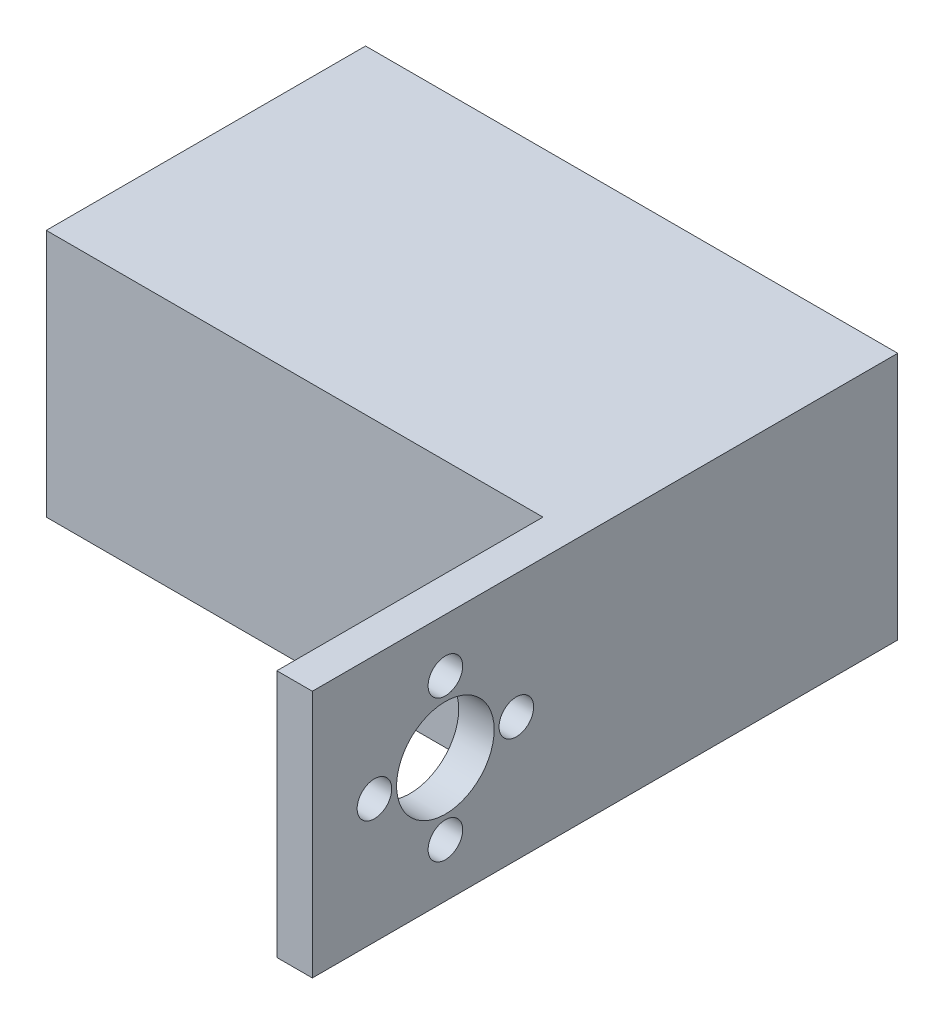
ISO-10303-21;
HEADER;
FILE_DESCRIPTION(('STEP AP214'),'2;1');
FILE_NAME('part.step','',(''),(''),'','','');
FILE_SCHEMA(('AUTOMOTIVE_DESIGN { 1 0 10303 214 1 1 1 1 }'));
ENDSEC;
DATA;
#1=APPLICATION_CONTEXT('core data for automotive mechanical design processes');
#2=APPLICATION_PROTOCOL_DEFINITION('international standard','automotive_design',2000,#1);
#3=PRODUCT_CONTEXT('',#1,'mechanical');
#4=PRODUCT('Part','Part','',(#3));
#5=PRODUCT_RELATED_PRODUCT_CATEGORY('part','',(#4));
#6=PRODUCT_DEFINITION_FORMATION('','',#4);
#7=PRODUCT_DEFINITION_CONTEXT('part definition',#1,'design');
#8=PRODUCT_DEFINITION('design','',#6,#7);
#9=PRODUCT_DEFINITION_SHAPE('','',#8);
#10=(LENGTH_UNIT() NAMED_UNIT(*) SI_UNIT(.MILLI.,.METRE.));
#11=(NAMED_UNIT(*) PLANE_ANGLE_UNIT() SI_UNIT($,.RADIAN.));
#12=(NAMED_UNIT(*) SI_UNIT($,.STERADIAN.) SOLID_ANGLE_UNIT());
#13=UNCERTAINTY_MEASURE_WITH_UNIT(LENGTH_MEASURE(1.E-05),#10,'distance_accuracy_value','');
#14=(GEOMETRIC_REPRESENTATION_CONTEXT(3) GLOBAL_UNCERTAINTY_ASSIGNED_CONTEXT((#13)) GLOBAL_UNIT_ASSIGNED_CONTEXT((#10,
#11,#12)) REPRESENTATION_CONTEXT('',''));
#15=CARTESIAN_POINT('',(0.,0.,0.));
#16=DIRECTION('',(0.,0.,1.));
#17=DIRECTION('',(1.,0.,0.));
#18=AXIS2_PLACEMENT_3D('',#15,#16,#17);
#19=CARTESIAN_POINT('',(0.,0.,36.));
#20=DIRECTION('',(0.,0.,1.));
#21=DIRECTION('',(1.,0.,0.));
#22=AXIS2_PLACEMENT_3D('',#19,#20,#21);
#23=PLANE('',#22);
#24=DIRECTION('',(1.,0.,0.));
#25=VECTOR('',#24,1.);
#26=CARTESIAN_POINT('',(-10.,-24.,36.));
#27=LINE('',#26,#25);
#28=CARTESIAN_POINT('',(-10.,-24.,36.));
#29=VERTEX_POINT('',#28);
#30=CARTESIAN_POINT('',(46.,-24.,36.));
#31=VERTEX_POINT('',#30);
#32=EDGE_CURVE('E142',#29,#31,#27,.T.);
#33=ORIENTED_EDGE('',*,*,#32,.T.);
#34=DIRECTION('',(0.,1.,0.));
#35=VECTOR('',#34,1.);
#36=CARTESIAN_POINT('',(46.,4.,36.));
#37=LINE('',#36,#35);
#38=CARTESIAN_POINT('',(46.,4.,36.));
#39=VERTEX_POINT('',#38);
#40=EDGE_CURVE('E130',#31,#39,#37,.T.);
#41=ORIENTED_EDGE('',*,*,#40,.T.);
#42=DIRECTION('',(-1.,0.,0.));
#43=VECTOR('',#42,1.);
#44=CARTESIAN_POINT('',(50.,4.,36.));
#45=LINE('',#44,#43);
#46=CARTESIAN_POINT('',(-10.,4.,36.));
#47=VERTEX_POINT('',#46);
#48=EDGE_CURVE('E129',#39,#47,#45,.T.);
#49=ORIENTED_EDGE('',*,*,#48,.T.);
#50=DIRECTION('',(0.,-1.,0.));
#51=VECTOR('',#50,1.);
#52=CARTESIAN_POINT('',(-10.,4.,36.));
#53=LINE('',#52,#51);
#54=EDGE_CURVE('E138',#47,#29,#53,.T.);
#55=ORIENTED_EDGE('',*,*,#54,.T.);
#56=EDGE_LOOP('',(#33,#41,#49,#55));
#57=FACE_BOUND('',#56,.T.);
#58=ADVANCED_FACE('F32',(#57),#23,.T.);
#59=CARTESIAN_POINT('',(0.,0.,0.));
#60=DIRECTION('',(0.,0.,1.));
#61=DIRECTION('',(1.,0.,0.));
#62=AXIS2_PLACEMENT_3D('',#59,#60,#61);
#63=PLANE('',#62);
#64=CARTESIAN_POINT('',(44.4000000000001,-14.9999999999999,0.));
#65=DIRECTION('',(0.,0.,-1.));
#66=DIRECTION('',(-1.,0.,0.));
#67=AXIS2_PLACEMENT_3D('',#64,#65,#66);
#68=CIRCLE('',#67,2.2);
#69=CARTESIAN_POINT('',(42.2000000000001,-14.9999999999999,0.));
#70=VERTEX_POINT('',#69);
#71=EDGE_CURVE('E476',#70,#70,#68,.T.);
#72=ORIENTED_EDGE('',*,*,#71,.F.);
#73=EDGE_LOOP('',(#72));
#74=FACE_BOUND('',#73,.T.);
#75=CARTESIAN_POINT('',(-4.4,-5.00000000000006,0.));
#76=DIRECTION('',(0.,0.,-1.));
#77=DIRECTION('',(-1.,0.,0.));
#78=AXIS2_PLACEMENT_3D('',#75,#76,#77);
#79=CIRCLE('',#78,2.19999999999996);
#80=CARTESIAN_POINT('',(-6.59999999999996,-5.00000000000006,0.));
#81=VERTEX_POINT('',#80);
#82=EDGE_CURVE('E490',#81,#81,#79,.T.);
#83=ORIENTED_EDGE('',*,*,#82,.F.);
#84=EDGE_LOOP('',(#83));
#85=FACE_BOUND('',#84,.T.);
#86=CARTESIAN_POINT('',(-4.4,-15.0000000000001,0.));
#87=DIRECTION('',(0.,0.,-1.));
#88=DIRECTION('',(-1.,0.,0.));
#89=AXIS2_PLACEMENT_3D('',#86,#87,#88);
#90=CIRCLE('',#89,2.19999999999996);
#91=CARTESIAN_POINT('',(-6.59999999999996,-15.0000000000001,0.));
#92=VERTEX_POINT('',#91);
#93=EDGE_CURVE('E485',#92,#92,#90,.T.);
#94=ORIENTED_EDGE('',*,*,#93,.F.);
#95=EDGE_LOOP('',(#94));
#96=FACE_BOUND('',#95,.T.);
#97=CARTESIAN_POINT('',(44.4000000000001,-4.99999999999993,0.));
#98=DIRECTION('',(0.,0.,-1.));
#99=DIRECTION('',(-1.,0.,0.));
#100=AXIS2_PLACEMENT_3D('',#97,#98,#99);
#101=CIRCLE('',#100,2.2);
#102=CARTESIAN_POINT('',(42.2000000000001,-4.99999999999993,0.));
#103=VERTEX_POINT('',#102);
#104=EDGE_CURVE('E475',#103,#103,#101,.T.);
#105=ORIENTED_EDGE('',*,*,#104,.F.);
#106=EDGE_LOOP('',(#105));
#107=FACE_BOUND('',#106,.T.);
#108=DIRECTION('',(0.,-1.,0.));
#109=VECTOR('',#108,1.);
#110=CARTESIAN_POINT('',(-10.,4.,0.));
#111=LINE('',#110,#109);
#112=CARTESIAN_POINT('',(-10.,4.,0.));
#113=VERTEX_POINT('',#112);
#114=CARTESIAN_POINT('',(-10.,-24.,0.));
#115=VERTEX_POINT('',#114);
#116=EDGE_CURVE('E178',#113,#115,#111,.T.);
#117=ORIENTED_EDGE('',*,*,#116,.F.);
#118=DIRECTION('',(-1.,0.,0.));
#119=VECTOR('',#118,1.);
#120=CARTESIAN_POINT('',(-10.,4.,0.));
#121=LINE('',#120,#119);
#122=CARTESIAN_POINT('',(50.,4.,0.));
#123=VERTEX_POINT('',#122);
#124=EDGE_CURVE('E185',#123,#113,#121,.T.);
#125=ORIENTED_EDGE('',*,*,#124,.F.);
#126=DIRECTION('',(0.,1.,0.));
#127=VECTOR('',#126,1.);
#128=CARTESIAN_POINT('',(50.,4.,0.));
#129=LINE('',#128,#127);
#130=CARTESIAN_POINT('',(50.,-24.,0.));
#131=VERTEX_POINT('',#130);
#132=EDGE_CURVE('E183',#131,#123,#129,.T.);
#133=ORIENTED_EDGE('',*,*,#132,.F.);
#134=DIRECTION('',(1.,0.,0.));
#135=VECTOR('',#134,1.);
#136=CARTESIAN_POINT('',(-10.,-24.,0.));
#137=LINE('',#136,#135);
#138=EDGE_CURVE('E181',#115,#131,#137,.T.);
#139=ORIENTED_EDGE('',*,*,#138,.F.);
#140=EDGE_LOOP('',(#117,#125,#133,#139));
#141=FACE_BOUND('',#140,.T.);
#142=DIRECTION('',(0.,-1.,0.));
#143=VECTOR('',#142,1.);
#144=CARTESIAN_POINT('',(0.,0.,0.));
#145=LINE('',#144,#143);
#146=CARTESIAN_POINT('',(0.,0.,0.));
#147=VERTEX_POINT('',#146);
#148=CARTESIAN_POINT('',(0.,-20.,0.));
#149=VERTEX_POINT('',#148);
#150=EDGE_CURVE('E146',#147,#149,#145,.T.);
#151=ORIENTED_EDGE('',*,*,#150,.T.);
#152=DIRECTION('',(1.,0.,0.));
#153=VECTOR('',#152,1.);
#154=CARTESIAN_POINT('',(0.,-20.,0.));
#155=LINE('',#154,#153);
#156=CARTESIAN_POINT('',(40.,-20.,0.));
#157=VERTEX_POINT('',#156);
#158=EDGE_CURVE('E161',#149,#157,#155,.T.);
#159=ORIENTED_EDGE('',*,*,#158,.T.);
#160=DIRECTION('',(0.,1.,0.));
#161=VECTOR('',#160,1.);
#162=CARTESIAN_POINT('',(40.,0.,0.));
#163=LINE('',#162,#161);
#164=CARTESIAN_POINT('',(40.,0.,0.));
#165=VERTEX_POINT('',#164);
#166=EDGE_CURVE('E164',#157,#165,#163,.T.);
#167=ORIENTED_EDGE('',*,*,#166,.T.);
#168=DIRECTION('',(-1.,0.,0.));
#169=VECTOR('',#168,1.);
#170=CARTESIAN_POINT('',(0.,0.,0.));
#171=LINE('',#170,#169);
#172=EDGE_CURVE('E151',#165,#147,#171,.T.);
#173=ORIENTED_EDGE('',*,*,#172,.T.);
#174=EDGE_LOOP('',(#151,#159,#167,#173));
#175=FACE_BOUND('',#174,.T.);
#176=ADVANCED_FACE('F200',(#74,#85,#96,#107,#141,#175),#63,.F.);
#177=CARTESIAN_POINT('',(-10.,4.,32.));
#178=DIRECTION('',(1.,0.,0.));
#179=DIRECTION('',(0.,1.,0.));
#180=AXIS2_PLACEMENT_3D('',#177,#178,#179);
#181=PLANE('',#180);
#182=ORIENTED_EDGE('',*,*,#116,.T.);
#183=DIRECTION('',(0.,0.,-1.));
#184=VECTOR('',#183,1.);
#185=CARTESIAN_POINT('',(-10.,-24.,32.));
#186=LINE('',#185,#184);
#187=EDGE_CURVE('E11',#29,#115,#186,.T.);
#188=ORIENTED_EDGE('',*,*,#187,.F.);
#189=ORIENTED_EDGE('',*,*,#54,.F.);
#190=DIRECTION('',(0.,0.,-1.));
#191=VECTOR('',#190,1.);
#192=CARTESIAN_POINT('',(-10.,4.,32.));
#193=LINE('',#192,#191);
#194=EDGE_CURVE('E187',#47,#113,#193,.T.);
#195=ORIENTED_EDGE('',*,*,#194,.T.);
#196=EDGE_LOOP('',(#182,#188,#189,#195));
#197=FACE_BOUND('',#196,.T.);
#198=ADVANCED_FACE('F34',(#197),#181,.F.);
#199=CARTESIAN_POINT('',(-10.,-24.,32.));
#200=DIRECTION('',(0.,1.,0.));
#201=DIRECTION('',(0.,0.,1.));
#202=AXIS2_PLACEMENT_3D('',#199,#200,#201);
#203=PLANE('',#202);
#204=ORIENTED_EDGE('',*,*,#138,.T.);
#205=DIRECTION('',(0.,0.,-1.));
#206=VECTOR('',#205,1.);
#207=CARTESIAN_POINT('',(50.,-24.,32.));
#208=LINE('',#207,#206);
#209=CARTESIAN_POINT('',(50.,-24.,66.));
#210=VERTEX_POINT('',#209);
#211=EDGE_CURVE('E40',#210,#131,#208,.T.);
#212=ORIENTED_EDGE('',*,*,#211,.F.);
#213=DIRECTION('',(1.,0.,0.));
#214=VECTOR('',#213,1.);
#215=CARTESIAN_POINT('',(46.,-24.,66.));
#216=LINE('',#215,#214);
#217=CARTESIAN_POINT('',(46.,-24.,66.));
#218=VERTEX_POINT('',#217);
#219=EDGE_CURVE('E120',#218,#210,#216,.T.);
#220=ORIENTED_EDGE('',*,*,#219,.F.);
#221=DIRECTION('',(0.,0.,-1.));
#222=VECTOR('',#221,1.);
#223=CARTESIAN_POINT('',(46.,-24.,36.));
#224=LINE('',#223,#222);
#225=EDGE_CURVE('E121',#218,#31,#224,.T.);
#226=ORIENTED_EDGE('',*,*,#225,.T.);
#227=ORIENTED_EDGE('',*,*,#32,.F.);
#228=ORIENTED_EDGE('',*,*,#187,.T.);
#229=EDGE_LOOP('',(#204,#212,#220,#226,#227,#228));
#230=FACE_BOUND('',#229,.T.);
#231=ADVANCED_FACE('F206',(#230),#203,.F.);
#232=CARTESIAN_POINT('',(50.,4.,32.));
#233=DIRECTION('',(-1.,0.,0.));
#234=DIRECTION('',(0.,0.,1.));
#235=AXIS2_PLACEMENT_3D('',#232,#233,#234);
#236=PLANE('',#235);
#237=CARTESIAN_POINT('',(50.,-18.0000000000002,50.9999999999995));
#238=DIRECTION('',(1.,0.,0.));
#239=DIRECTION('',(0.,0.,-1.));
#240=AXIS2_PLACEMENT_3D('',#237,#238,#239);
#241=CIRCLE('',#240,1.95000000000048);
#242=CARTESIAN_POINT('',(50.,-18.0000000000002,49.0499999999991));
#243=VERTEX_POINT('',#242);
#244=EDGE_CURVE('E497',#243,#243,#241,.T.);
#245=ORIENTED_EDGE('',*,*,#244,.F.);
#246=EDGE_LOOP('',(#245));
#247=FACE_BOUND('',#246,.T.);
#248=CARTESIAN_POINT('',(50.,-10.0000000000004,58.9999999999998));
#249=DIRECTION('',(1.,0.,0.));
#250=DIRECTION('',(0.,0.,-1.));
#251=AXIS2_PLACEMENT_3D('',#248,#249,#250);
#252=CIRCLE('',#251,1.95000000000036);
#253=CARTESIAN_POINT('',(50.,-10.0000000000004,57.0499999999994));
#254=VERTEX_POINT('',#253);
#255=EDGE_CURVE('E505',#254,#254,#252,.T.);
#256=ORIENTED_EDGE('',*,*,#255,.F.);
#257=EDGE_LOOP('',(#256));
#258=FACE_BOUND('',#257,.T.);
#259=CARTESIAN_POINT('',(50.,-9.99999999999995,42.9999999999998));
#260=DIRECTION('',(1.,0.,0.));
#261=DIRECTION('',(0.,0.,-1.));
#262=AXIS2_PLACEMENT_3D('',#259,#260,#261);
#263=CIRCLE('',#262,1.95000000000017);
#264=CARTESIAN_POINT('',(50.,-9.99999999999995,41.0499999999996));
#265=VERTEX_POINT('',#264);
#266=EDGE_CURVE('E511',#265,#265,#263,.T.);
#267=ORIENTED_EDGE('',*,*,#266,.F.);
#268=EDGE_LOOP('',(#267));
#269=FACE_BOUND('',#268,.T.);
#270=CARTESIAN_POINT('',(50.,-2.00000000000018,51.));
#271=DIRECTION('',(1.,0.,0.));
#272=DIRECTION('',(0.,0.,-1.));
#273=AXIS2_PLACEMENT_3D('',#270,#271,#272);
#274=CIRCLE('',#273,1.95);
#275=CARTESIAN_POINT('',(50.,-2.00000000000018,49.05));
#276=VERTEX_POINT('',#275);
#277=EDGE_CURVE('E495',#276,#276,#274,.T.);
#278=ORIENTED_EDGE('',*,*,#277,.F.);
#279=EDGE_LOOP('',(#278));
#280=FACE_BOUND('',#279,.T.);
#281=ORIENTED_EDGE('',*,*,#132,.T.);
#282=DIRECTION('',(0.,0.,-1.));
#283=VECTOR('',#282,1.);
#284=CARTESIAN_POINT('',(50.,4.,32.));
#285=LINE('',#284,#283);
#286=CARTESIAN_POINT('',(50.,4.,66.));
#287=VERTEX_POINT('',#286);
#288=EDGE_CURVE('E190',#287,#123,#285,.T.);
#289=ORIENTED_EDGE('',*,*,#288,.F.);
#290=DIRECTION('',(0.,-1.,0.));
#291=VECTOR('',#290,1.);
#292=CARTESIAN_POINT('',(50.,4.,66.));
#293=LINE('',#292,#291);
#294=EDGE_CURVE('E117',#287,#210,#293,.T.);
#295=ORIENTED_EDGE('',*,*,#294,.T.);
#296=ORIENTED_EDGE('',*,*,#211,.T.);
#297=EDGE_LOOP('',(#281,#289,#295,#296));
#298=FACE_BOUND('',#297,.T.);
#299=CARTESIAN_POINT('',(50.,-10.,51.));
#300=DIRECTION('',(1.,0.,0.));
#301=DIRECTION('',(0.,0.,-1.));
#302=AXIS2_PLACEMENT_3D('',#299,#300,#301);
#303=CIRCLE('',#302,5.5);
#304=CARTESIAN_POINT('',(50.,-10.,45.5));
#305=VERTEX_POINT('',#304);
#306=EDGE_CURVE('E504',#305,#305,#303,.T.);
#307=ORIENTED_EDGE('',*,*,#306,.F.);
#308=EDGE_LOOP('',(#307));
#309=FACE_BOUND('',#308,.T.);
#310=ADVANCED_FACE('F194',(#247,#258,#269,#280,#298,#309),#236,.F.);
#311=CARTESIAN_POINT('',(-10.,4.,32.));
#312=DIRECTION('',(0.,-1.,0.));
#313=DIRECTION('',(0.,0.,-1.));
#314=AXIS2_PLACEMENT_3D('',#311,#312,#313);
#315=PLANE('',#314);
#316=ORIENTED_EDGE('',*,*,#124,.T.);
#317=ORIENTED_EDGE('',*,*,#194,.F.);
#318=ORIENTED_EDGE('',*,*,#48,.F.);
#319=DIRECTION('',(0.,0.,1.));
#320=VECTOR('',#319,1.);
#321=CARTESIAN_POINT('',(46.,4.,36.));
#322=LINE('',#321,#320);
#323=CARTESIAN_POINT('',(46.,4.,66.));
#324=VERTEX_POINT('',#323);
#325=EDGE_CURVE('E47',#39,#324,#322,.T.);
#326=ORIENTED_EDGE('',*,*,#325,.T.);
#327=DIRECTION('',(1.,0.,0.));
#328=VECTOR('',#327,1.);
#329=CARTESIAN_POINT('',(46.,4.,66.));
#330=LINE('',#329,#328);
#331=EDGE_CURVE('E111',#324,#287,#330,.T.);
#332=ORIENTED_EDGE('',*,*,#331,.T.);
#333=ORIENTED_EDGE('',*,*,#288,.T.);
#334=EDGE_LOOP('',(#316,#317,#318,#326,#332,#333));
#335=FACE_BOUND('',#334,.T.);
#336=ADVANCED_FACE('F127',(#335),#315,.F.);
#337=CARTESIAN_POINT('',(0.,0.,32.));
#338=DIRECTION('',(1.,0.,0.));
#339=DIRECTION('',(0.,1.,0.));
#340=AXIS2_PLACEMENT_3D('',#337,#338,#339);
#341=PLANE('',#340);
#342=ORIENTED_EDGE('',*,*,#150,.F.);
#343=DIRECTION('',(0.,0.,-1.));
#344=VECTOR('',#343,1.);
#345=CARTESIAN_POINT('',(0.,0.,32.));
#346=LINE('',#345,#344);
#347=CARTESIAN_POINT('',(0.,0.,32.));
#348=VERTEX_POINT('',#347);
#349=EDGE_CURVE('E158',#348,#147,#346,.T.);
#350=ORIENTED_EDGE('',*,*,#349,.F.);
#351=DIRECTION('',(0.,-1.,0.));
#352=VECTOR('',#351,1.);
#353=CARTESIAN_POINT('',(0.,0.,32.));
#354=LINE('',#353,#352);
#355=CARTESIAN_POINT('',(0.,-20.,32.));
#356=VERTEX_POINT('',#355);
#357=EDGE_CURVE('E147',#348,#356,#354,.T.);
#358=ORIENTED_EDGE('',*,*,#357,.T.);
#359=DIRECTION('',(0.,0.,-1.));
#360=VECTOR('',#359,1.);
#361=CARTESIAN_POINT('',(0.,-20.,32.));
#362=LINE('',#361,#360);
#363=EDGE_CURVE('E175',#356,#149,#362,.T.);
#364=ORIENTED_EDGE('',*,*,#363,.T.);
#365=EDGE_LOOP('',(#342,#350,#358,#364));
#366=FACE_BOUND('',#365,.T.);
#367=ADVANCED_FACE('F238',(#366),#341,.T.);
#368=CARTESIAN_POINT('',(0.,-20.,32.));
#369=DIRECTION('',(0.,1.,0.));
#370=DIRECTION('',(0.,0.,1.));
#371=AXIS2_PLACEMENT_3D('',#368,#369,#370);
#372=PLANE('',#371);
#373=ORIENTED_EDGE('',*,*,#158,.F.);
#374=ORIENTED_EDGE('',*,*,#363,.F.);
#375=DIRECTION('',(1.,0.,0.));
#376=VECTOR('',#375,1.);
#377=CARTESIAN_POINT('',(0.,-20.,32.));
#378=LINE('',#377,#376);
#379=CARTESIAN_POINT('',(40.,-20.,32.));
#380=VERTEX_POINT('',#379);
#381=EDGE_CURVE('E150',#356,#380,#378,.T.);
#382=ORIENTED_EDGE('',*,*,#381,.T.);
#383=DIRECTION('',(0.,0.,-1.));
#384=VECTOR('',#383,1.);
#385=CARTESIAN_POINT('',(40.,-20.,32.));
#386=LINE('',#385,#384);
#387=EDGE_CURVE('E173',#380,#157,#386,.T.);
#388=ORIENTED_EDGE('',*,*,#387,.T.);
#389=EDGE_LOOP('',(#373,#374,#382,#388));
#390=FACE_BOUND('',#389,.T.);
#391=ADVANCED_FACE('F234',(#390),#372,.T.);
#392=CARTESIAN_POINT('',(40.,0.,32.));
#393=DIRECTION('',(-1.,0.,0.));
#394=DIRECTION('',(0.,0.,1.));
#395=AXIS2_PLACEMENT_3D('',#392,#393,#394);
#396=PLANE('',#395);
#397=ORIENTED_EDGE('',*,*,#166,.F.);
#398=ORIENTED_EDGE('',*,*,#387,.F.);
#399=DIRECTION('',(0.,1.,0.));
#400=VECTOR('',#399,1.);
#401=CARTESIAN_POINT('',(40.,0.,32.));
#402=LINE('',#401,#400);
#403=CARTESIAN_POINT('',(40.,0.,32.));
#404=VERTEX_POINT('',#403);
#405=EDGE_CURVE('E154',#380,#404,#402,.T.);
#406=ORIENTED_EDGE('',*,*,#405,.T.);
#407=DIRECTION('',(0.,0.,-1.));
#408=VECTOR('',#407,1.);
#409=CARTESIAN_POINT('',(40.,0.,32.));
#410=LINE('',#409,#408);
#411=EDGE_CURVE('E171',#404,#165,#410,.T.);
#412=ORIENTED_EDGE('',*,*,#411,.T.);
#413=EDGE_LOOP('',(#397,#398,#406,#412));
#414=FACE_BOUND('',#413,.T.);
#415=ADVANCED_FACE('F230',(#414),#396,.T.);
#416=CARTESIAN_POINT('',(0.,0.,32.));
#417=DIRECTION('',(0.,-1.,0.));
#418=DIRECTION('',(0.,0.,-1.));
#419=AXIS2_PLACEMENT_3D('',#416,#417,#418);
#420=PLANE('',#419);
#421=ORIENTED_EDGE('',*,*,#172,.F.);
#422=ORIENTED_EDGE('',*,*,#411,.F.);
#423=DIRECTION('',(-1.,0.,0.));
#424=VECTOR('',#423,1.);
#425=CARTESIAN_POINT('',(0.,0.,32.));
#426=LINE('',#425,#424);
#427=EDGE_CURVE('E55',#404,#348,#426,.T.);
#428=ORIENTED_EDGE('',*,*,#427,.T.);
#429=ORIENTED_EDGE('',*,*,#349,.T.);
#430=EDGE_LOOP('',(#421,#422,#428,#429));
#431=FACE_BOUND('',#430,.T.);
#432=ADVANCED_FACE('F227',(#431),#420,.T.);
#433=CARTESIAN_POINT('',(0.,0.,32.));
#434=DIRECTION('',(0.,0.,1.));
#435=DIRECTION('',(1.,0.,0.));
#436=AXIS2_PLACEMENT_3D('',#433,#434,#435);
#437=PLANE('',#436);
#438=ORIENTED_EDGE('',*,*,#381,.F.);
#439=ORIENTED_EDGE('',*,*,#357,.F.);
#440=ORIENTED_EDGE('',*,*,#427,.F.);
#441=ORIENTED_EDGE('',*,*,#405,.F.);
#442=EDGE_LOOP('',(#438,#439,#440,#441));
#443=FACE_BOUND('',#442,.T.);
#444=ADVANCED_FACE('F224',(#443),#437,.F.);
#445=CARTESIAN_POINT('',(46.,4.,66.));
#446=DIRECTION('',(0.,0.,1.));
#447=DIRECTION('',(1.,0.,0.));
#448=AXIS2_PLACEMENT_3D('',#445,#446,#447);
#449=PLANE('',#448);
#450=ORIENTED_EDGE('',*,*,#294,.F.);
#451=ORIENTED_EDGE('',*,*,#331,.F.);
#452=DIRECTION('',(0.,-1.,0.));
#453=VECTOR('',#452,1.);
#454=CARTESIAN_POINT('',(46.,4.,66.));
#455=LINE('',#454,#453);
#456=EDGE_CURVE('E114',#324,#218,#455,.T.);
#457=ORIENTED_EDGE('',*,*,#456,.T.);
#458=ORIENTED_EDGE('',*,*,#219,.T.);
#459=EDGE_LOOP('',(#450,#451,#457,#458));
#460=FACE_BOUND('',#459,.T.);
#461=ADVANCED_FACE('F112',(#460),#449,.T.);
#462=CARTESIAN_POINT('',(46.,0.,0.));
#463=DIRECTION('',(-1.,0.,0.));
#464=DIRECTION('',(0.,0.,1.));
#465=AXIS2_PLACEMENT_3D('',#462,#463,#464);
#466=PLANE('',#465);
#467=CARTESIAN_POINT('',(46.,-18.0000000000002,50.9999999999995));
#468=DIRECTION('',(-1.,0.,0.));
#469=DIRECTION('',(0.,0.,1.));
#470=AXIS2_PLACEMENT_3D('',#467,#468,#469);
#471=CIRCLE('',#470,1.95000000000048);
#472=CARTESIAN_POINT('',(46.,-18.0000000000002,52.95));
#473=VERTEX_POINT('',#472);
#474=EDGE_CURVE('E500',#473,#473,#471,.F.);
#475=ORIENTED_EDGE('',*,*,#474,.T.);
#476=EDGE_LOOP('',(#475));
#477=FACE_BOUND('',#476,.T.);
#478=CARTESIAN_POINT('',(46.,-10.0000000000004,58.9999999999998));
#479=DIRECTION('',(-1.,0.,0.));
#480=DIRECTION('',(0.,0.,1.));
#481=AXIS2_PLACEMENT_3D('',#478,#479,#480);
#482=CIRCLE('',#481,1.95000000000036);
#483=CARTESIAN_POINT('',(46.,-10.0000000000004,60.9500000000001));
#484=VERTEX_POINT('',#483);
#485=EDGE_CURVE('E501',#484,#484,#482,.F.);
#486=ORIENTED_EDGE('',*,*,#485,.T.);
#487=EDGE_LOOP('',(#486));
#488=FACE_BOUND('',#487,.T.);
#489=CARTESIAN_POINT('',(46.,-9.99999999999995,42.9999999999998));
#490=DIRECTION('',(-1.,0.,0.));
#491=DIRECTION('',(0.,0.,1.));
#492=AXIS2_PLACEMENT_3D('',#489,#490,#491);
#493=CIRCLE('',#492,1.95000000000017);
#494=CARTESIAN_POINT('',(46.,-9.99999999999995,44.9499999999999));
#495=VERTEX_POINT('',#494);
#496=EDGE_CURVE('E508',#495,#495,#493,.F.);
#497=ORIENTED_EDGE('',*,*,#496,.T.);
#498=EDGE_LOOP('',(#497));
#499=FACE_BOUND('',#498,.T.);
#500=CARTESIAN_POINT('',(46.,-2.00000000000018,51.));
#501=DIRECTION('',(-1.,0.,0.));
#502=DIRECTION('',(0.,0.,1.));
#503=AXIS2_PLACEMENT_3D('',#500,#501,#502);
#504=CIRCLE('',#503,1.95);
#505=CARTESIAN_POINT('',(46.,-2.00000000000018,52.95));
#506=VERTEX_POINT('',#505);
#507=EDGE_CURVE('E514',#506,#506,#504,.F.);
#508=ORIENTED_EDGE('',*,*,#507,.T.);
#509=EDGE_LOOP('',(#508));
#510=FACE_BOUND('',#509,.T.);
#511=CARTESIAN_POINT('',(46.,-10.,51.));
#512=DIRECTION('',(1.,0.,0.));
#513=DIRECTION('',(0.,0.,-1.));
#514=AXIS2_PLACEMENT_3D('',#511,#512,#513);
#515=CIRCLE('',#514,5.5);
#516=CARTESIAN_POINT('',(46.,-10.,45.5));
#517=VERTEX_POINT('',#516);
#518=EDGE_CURVE('E137',#517,#517,#515,.T.);
#519=ORIENTED_EDGE('',*,*,#518,.T.);
#520=EDGE_LOOP('',(#519));
#521=FACE_BOUND('',#520,.T.);
#522=ORIENTED_EDGE('',*,*,#40,.F.);
#523=ORIENTED_EDGE('',*,*,#225,.F.);
#524=ORIENTED_EDGE('',*,*,#456,.F.);
#525=ORIENTED_EDGE('',*,*,#325,.F.);
#526=EDGE_LOOP('',(#522,#523,#524,#525));
#527=FACE_BOUND('',#526,.T.);
#528=ADVANCED_FACE('F123',(#477,#488,#499,#510,#521,#527),#466,.T.);
#529=CARTESIAN_POINT('',(46.,-10.,51.));
#530=DIRECTION('',(1.,0.,0.));
#531=DIRECTION('',(0.,0.,-1.));
#532=AXIS2_PLACEMENT_3D('',#529,#530,#531);
#533=CYLINDRICAL_SURFACE('',#532,5.5);
#534=ORIENTED_EDGE('',*,*,#518,.F.);
#535=EDGE_LOOP('',(#534));
#536=FACE_BOUND('',#535,.T.);
#537=ORIENTED_EDGE('',*,*,#306,.T.);
#538=EDGE_LOOP('',(#537));
#539=FACE_BOUND('',#538,.T.);
#540=ADVANCED_FACE('F281',(#536,#539),#533,.F.);
#541=CARTESIAN_POINT('',(40.4845671067436,-2.00000000000018,51.));
#542=DIRECTION('',(1.,0.,0.));
#543=DIRECTION('',(0.,0.,-1.));
#544=AXIS2_PLACEMENT_3D('',#541,#542,#543);
#545=CYLINDRICAL_SURFACE('',#544,1.95);
#546=ORIENTED_EDGE('',*,*,#277,.T.);
#547=EDGE_LOOP('',(#546));
#548=FACE_BOUND('',#547,.T.);
#549=ORIENTED_EDGE('',*,*,#507,.F.);
#550=EDGE_LOOP('',(#549));
#551=FACE_BOUND('',#550,.T.);
#552=ADVANCED_FACE('F288',(#548,#551),#545,.F.);
#553=CARTESIAN_POINT('',(40.4845671067436,-9.99999999999995,42.9999999999998));
#554=DIRECTION('',(1.,0.,0.));
#555=DIRECTION('',(0.,0.,-1.));
#556=AXIS2_PLACEMENT_3D('',#553,#554,#555);
#557=CYLINDRICAL_SURFACE('',#556,1.95000000000017);
#558=ORIENTED_EDGE('',*,*,#266,.T.);
#559=EDGE_LOOP('',(#558));
#560=FACE_BOUND('',#559,.T.);
#561=ORIENTED_EDGE('',*,*,#496,.F.);
#562=EDGE_LOOP('',(#561));
#563=FACE_BOUND('',#562,.T.);
#564=ADVANCED_FACE('F295',(#560,#563),#557,.F.);
#565=CARTESIAN_POINT('',(40.4845671067436,-10.0000000000004,58.9999999999998));
#566=DIRECTION('',(1.,0.,0.));
#567=DIRECTION('',(0.,0.,-1.));
#568=AXIS2_PLACEMENT_3D('',#565,#566,#567);
#569=CYLINDRICAL_SURFACE('',#568,1.95000000000036);
#570=ORIENTED_EDGE('',*,*,#255,.T.);
#571=EDGE_LOOP('',(#570));
#572=FACE_BOUND('',#571,.T.);
#573=ORIENTED_EDGE('',*,*,#485,.F.);
#574=EDGE_LOOP('',(#573));
#575=FACE_BOUND('',#574,.T.);
#576=ADVANCED_FACE('F303',(#572,#575),#569,.F.);
#577=CARTESIAN_POINT('',(40.4845671067436,-18.0000000000002,50.9999999999995));
#578=DIRECTION('',(1.,0.,0.));
#579=DIRECTION('',(0.,0.,-1.));
#580=AXIS2_PLACEMENT_3D('',#577,#578,#579);
#581=CYLINDRICAL_SURFACE('',#580,1.95000000000048);
#582=ORIENTED_EDGE('',*,*,#244,.T.);
#583=EDGE_LOOP('',(#582));
#584=FACE_BOUND('',#583,.T.);
#585=ORIENTED_EDGE('',*,*,#474,.F.);
#586=EDGE_LOOP('',(#585));
#587=FACE_BOUND('',#586,.T.);
#588=ADVANCED_FACE('F311',(#584,#587),#581,.F.);
#589=CARTESIAN_POINT('',(44.4000000000001,-4.99999999999993,15.));
#590=DIRECTION('',(0.,0.,-1.));
#591=DIRECTION('',(-1.,0.,0.));
#592=AXIS2_PLACEMENT_3D('',#589,#590,#591);
#593=CYLINDRICAL_SURFACE('',#592,2.2);
#594=CARTESIAN_POINT('',(44.4000000000001,-4.99999999999993,15.));
#595=DIRECTION('',(0.,0.,-1.));
#596=DIRECTION('',(-1.,0.,0.));
#597=AXIS2_PLACEMENT_3D('',#594,#595,#596);
#598=CIRCLE('',#597,2.2);
#599=CARTESIAN_POINT('',(42.2000000000001,-4.99999999999993,15.));
#600=VERTEX_POINT('',#599);
#601=EDGE_CURVE('E479',#600,#600,#598,.T.);
#602=ORIENTED_EDGE('',*,*,#601,.F.);
#603=EDGE_LOOP('',(#602));
#604=FACE_BOUND('',#603,.T.);
#605=ORIENTED_EDGE('',*,*,#104,.T.);
#606=EDGE_LOOP('',(#605));
#607=FACE_BOUND('',#606,.T.);
#608=ADVANCED_FACE('F319',(#604,#607),#593,.F.);
#609=CARTESIAN_POINT('',(44.4000000000001,-4.99999999999993,15.));
#610=DIRECTION('',(0.,0.,-1.));
#611=DIRECTION('',(-1.,0.,0.));
#612=AXIS2_PLACEMENT_3D('',#609,#610,#611);
#613=PLANE('',#612);
#614=ORIENTED_EDGE('',*,*,#601,.T.);
#615=EDGE_LOOP('',(#614));
#616=FACE_BOUND('',#615,.T.);
#617=ADVANCED_FACE('F328',(#616),#613,.T.);
#618=CARTESIAN_POINT('',(-4.4,-15.0000000000001,15.));
#619=DIRECTION('',(0.,0.,-1.));
#620=DIRECTION('',(-1.,0.,0.));
#621=AXIS2_PLACEMENT_3D('',#618,#619,#620);
#622=CYLINDRICAL_SURFACE('',#621,2.19999999999996);
#623=CARTESIAN_POINT('',(-4.4,-15.0000000000001,15.));
#624=DIRECTION('',(0.,0.,-1.));
#625=DIRECTION('',(-1.,0.,0.));
#626=AXIS2_PLACEMENT_3D('',#623,#624,#625);
#627=CIRCLE('',#626,2.19999999999996);
#628=CARTESIAN_POINT('',(-6.59999999999996,-15.0000000000001,15.));
#629=VERTEX_POINT('',#628);
#630=EDGE_CURVE('E493',#629,#629,#627,.T.);
#631=ORIENTED_EDGE('',*,*,#630,.F.);
#632=EDGE_LOOP('',(#631));
#633=FACE_BOUND('',#632,.T.);
#634=ORIENTED_EDGE('',*,*,#93,.T.);
#635=EDGE_LOOP('',(#634));
#636=FACE_BOUND('',#635,.T.);
#637=ADVANCED_FACE('F336',(#633,#636),#622,.F.);
#638=CARTESIAN_POINT('',(-4.4,-15.0000000000001,15.));
#639=DIRECTION('',(0.,0.,-1.));
#640=DIRECTION('',(-1.,0.,0.));
#641=AXIS2_PLACEMENT_3D('',#638,#639,#640);
#642=PLANE('',#641);
#643=ORIENTED_EDGE('',*,*,#630,.T.);
#644=EDGE_LOOP('',(#643));
#645=FACE_BOUND('',#644,.T.);
#646=ADVANCED_FACE('F344',(#645),#642,.T.);
#647=CARTESIAN_POINT('',(-4.4,-5.00000000000006,15.));
#648=DIRECTION('',(0.,0.,-1.));
#649=DIRECTION('',(-1.,0.,0.));
#650=AXIS2_PLACEMENT_3D('',#647,#648,#649);
#651=CYLINDRICAL_SURFACE('',#650,2.19999999999996);
#652=CARTESIAN_POINT('',(-4.4,-5.00000000000006,15.));
#653=DIRECTION('',(0.,0.,-1.));
#654=DIRECTION('',(-1.,0.,0.));
#655=AXIS2_PLACEMENT_3D('',#652,#653,#654);
#656=CIRCLE('',#655,2.19999999999996);
#657=CARTESIAN_POINT('',(-6.59999999999996,-5.00000000000006,15.));
#658=VERTEX_POINT('',#657);
#659=EDGE_CURVE('E482',#658,#658,#656,.T.);
#660=ORIENTED_EDGE('',*,*,#659,.F.);
#661=EDGE_LOOP('',(#660));
#662=FACE_BOUND('',#661,.T.);
#663=ORIENTED_EDGE('',*,*,#82,.T.);
#664=EDGE_LOOP('',(#663));
#665=FACE_BOUND('',#664,.T.);
#666=ADVANCED_FACE('F352',(#662,#665),#651,.F.);
#667=CARTESIAN_POINT('',(-4.4,-5.00000000000006,15.));
#668=DIRECTION('',(0.,0.,-1.));
#669=DIRECTION('',(-1.,0.,0.));
#670=AXIS2_PLACEMENT_3D('',#667,#668,#669);
#671=PLANE('',#670);
#672=ORIENTED_EDGE('',*,*,#659,.T.);
#673=EDGE_LOOP('',(#672));
#674=FACE_BOUND('',#673,.T.);
#675=ADVANCED_FACE('F360',(#674),#671,.T.);
#676=CARTESIAN_POINT('',(44.4000000000001,-14.9999999999999,15.));
#677=DIRECTION('',(0.,0.,-1.));
#678=DIRECTION('',(-1.,0.,0.));
#679=AXIS2_PLACEMENT_3D('',#676,#677,#678);
#680=CYLINDRICAL_SURFACE('',#679,2.2);
#681=CARTESIAN_POINT('',(44.4000000000001,-14.9999999999999,15.));
#682=DIRECTION('',(0.,0.,-1.));
#683=DIRECTION('',(-1.,0.,0.));
#684=AXIS2_PLACEMENT_3D('',#681,#682,#683);
#685=CIRCLE('',#684,2.2);
#686=CARTESIAN_POINT('',(42.2000000000001,-14.9999999999999,15.));
#687=VERTEX_POINT('',#686);
#688=EDGE_CURVE('E474',#687,#687,#685,.T.);
#689=ORIENTED_EDGE('',*,*,#688,.F.);
#690=EDGE_LOOP('',(#689));
#691=FACE_BOUND('',#690,.T.);
#692=ORIENTED_EDGE('',*,*,#71,.T.);
#693=EDGE_LOOP('',(#692));
#694=FACE_BOUND('',#693,.T.);
#695=ADVANCED_FACE('F368',(#691,#694),#680,.F.);
#696=CARTESIAN_POINT('',(44.4000000000001,-14.9999999999999,15.));
#697=DIRECTION('',(0.,0.,-1.));
#698=DIRECTION('',(-1.,0.,0.));
#699=AXIS2_PLACEMENT_3D('',#696,#697,#698);
#700=PLANE('',#699);
#701=ORIENTED_EDGE('',*,*,#688,.T.);
#702=EDGE_LOOP('',(#701));
#703=FACE_BOUND('',#702,.T.);
#704=ADVANCED_FACE('F376',(#703),#700,.T.);
#705=CLOSED_SHELL('',(#58,#176,#198,#231,#310,#336,#367,#391,#415,#432,#444,#461,#528,#540,#552,
#564,#576,#588,#608,#617,#637,#646,#666,#675,#695,#704));
#706=MANIFOLD_SOLID_BREP('B2',#705);
#707=ADVANCED_BREP_SHAPE_REPRESENTATION('',(#18,#706),#14);
#708=SHAPE_DEFINITION_REPRESENTATION(#9,#707);
ENDSEC;
END-ISO-10303-21;
